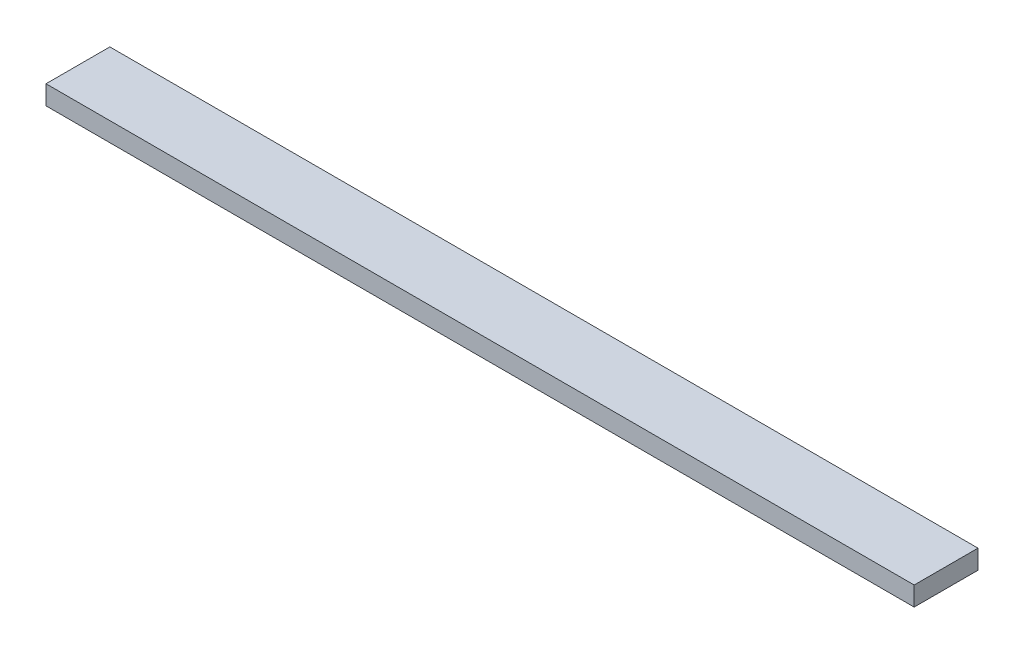
ISO-10303-21;
HEADER;
FILE_DESCRIPTION(('STEP AP214'),'2;1');
FILE_NAME('part.step','',(''),(''),'','','');
FILE_SCHEMA(('AUTOMOTIVE_DESIGN { 1 0 10303 214 1 1 1 1 }'));
ENDSEC;
DATA;
#1=APPLICATION_CONTEXT('core data for automotive mechanical design processes');
#2=APPLICATION_PROTOCOL_DEFINITION('international standard','automotive_design',2000,#1);
#3=PRODUCT_CONTEXT('',#1,'mechanical');
#4=PRODUCT('Part','Part','',(#3));
#5=PRODUCT_RELATED_PRODUCT_CATEGORY('part','',(#4));
#6=PRODUCT_DEFINITION_FORMATION('','',#4);
#7=PRODUCT_DEFINITION_CONTEXT('part definition',#1,'design');
#8=PRODUCT_DEFINITION('design','',#6,#7);
#9=PRODUCT_DEFINITION_SHAPE('','',#8);
#10=(LENGTH_UNIT() NAMED_UNIT(*) SI_UNIT(.MILLI.,.METRE.));
#11=(NAMED_UNIT(*) PLANE_ANGLE_UNIT() SI_UNIT($,.RADIAN.));
#12=(NAMED_UNIT(*) SI_UNIT($,.STERADIAN.) SOLID_ANGLE_UNIT());
#13=UNCERTAINTY_MEASURE_WITH_UNIT(LENGTH_MEASURE(1.E-05),#10,'distance_accuracy_value','');
#14=(GEOMETRIC_REPRESENTATION_CONTEXT(3) GLOBAL_UNCERTAINTY_ASSIGNED_CONTEXT((#13)) GLOBAL_UNIT_ASSIGNED_CONTEXT((#10,
#11,#12)) REPRESENTATION_CONTEXT('',''));
#15=CARTESIAN_POINT('',(0.,0.,0.));
#16=DIRECTION('',(0.,0.,1.));
#17=DIRECTION('',(1.,0.,0.));
#18=AXIS2_PLACEMENT_3D('',#15,#16,#17);
#19=CARTESIAN_POINT('',(-35.36,105.5,93.45));
#20=DIRECTION('',(0.,1.,0.));
#21=DIRECTION('',(1.,0.,0.));
#22=AXIS2_PLACEMENT_3D('',#19,#20,#21);
#23=PLANE('',#22);
#24=DIRECTION('',(1.,0.,0.));
#25=VECTOR('',#24,1.);
#26=CARTESIAN_POINT('',(0.,105.50000000004,88.35));
#27=LINE('',#26,#25);
#28=CARTESIAN_POINT('',(-34.,105.50000000002,88.35));
#29=VERTEX_POINT('',#28);
#30=CARTESIAN_POINT('',(34.,105.50000000002,88.35));
#31=VERTEX_POINT('',#30);
#32=EDGE_CURVE('E53',#29,#31,#27,.T.);
#33=ORIENTED_EDGE('',*,*,#32,.F.);
#34=DIRECTION('',(0.,0.,-1.));
#35=VECTOR('',#34,1.);
#36=CARTESIAN_POINT('',(-34.,105.50000000004,90.85));
#37=LINE('',#36,#35);
#38=CARTESIAN_POINT('',(-34.,105.50000000003,93.35));
#39=VERTEX_POINT('',#38);
#40=EDGE_CURVE('E68',#39,#29,#37,.T.);
#41=ORIENTED_EDGE('',*,*,#40,.F.);
#42=DIRECTION('',(-1.,0.,0.));
#43=VECTOR('',#42,1.);
#44=CARTESIAN_POINT('',(0.,105.50000000004,93.35));
#45=LINE('',#44,#43);
#46=CARTESIAN_POINT('',(34.,105.50000000002,93.35));
#47=VERTEX_POINT('',#46);
#48=EDGE_CURVE('E20',#47,#39,#45,.T.);
#49=ORIENTED_EDGE('',*,*,#48,.F.);
#50=DIRECTION('',(0.,0.,1.));
#51=VECTOR('',#50,1.);
#52=CARTESIAN_POINT('',(34.,105.50000000004,90.85));
#53=LINE('',#52,#51);
#54=EDGE_CURVE('E58',#31,#47,#53,.T.);
#55=ORIENTED_EDGE('',*,*,#54,.F.);
#56=EDGE_LOOP('',(#33,#41,#49,#55));
#57=FACE_BOUND('',#56,.T.);
#58=ADVANCED_FACE('F16',(#57),#23,.T.);
#59=CARTESIAN_POINT('',(-35.36,103.9181335233,93.35));
#60=DIRECTION('',(0.,0.,1.));
#61=DIRECTION('',(1.,0.,0.));
#62=AXIS2_PLACEMENT_3D('',#59,#60,#61);
#63=PLANE('',#62);
#64=ORIENTED_EDGE('',*,*,#48,.T.);
#65=DIRECTION('',(0.,1.,0.));
#66=VECTOR('',#65,1.);
#67=CARTESIAN_POINT('',(-34.,104.75,93.35));
#68=LINE('',#67,#66);
#69=CARTESIAN_POINT('',(-34.,103.99999999997,93.35));
#70=VERTEX_POINT('',#69);
#71=EDGE_CURVE('E79',#70,#39,#68,.T.);
#72=ORIENTED_EDGE('',*,*,#71,.F.);
#73=DIRECTION('',(1.,0.,0.));
#74=VECTOR('',#73,1.);
#75=CARTESIAN_POINT('',(0.,104.,93.35));
#76=LINE('',#75,#74);
#77=CARTESIAN_POINT('',(34.,103.99999999997,93.35));
#78=VERTEX_POINT('',#77);
#79=EDGE_CURVE('E74',#70,#78,#76,.T.);
#80=ORIENTED_EDGE('',*,*,#79,.T.);
#81=DIRECTION('',(0.,-1.,0.));
#82=VECTOR('',#81,1.);
#83=CARTESIAN_POINT('',(34.,104.75,93.35));
#84=LINE('',#83,#82);
#85=EDGE_CURVE('E63',#47,#78,#84,.T.);
#86=ORIENTED_EDGE('',*,*,#85,.F.);
#87=EDGE_LOOP('',(#64,#72,#80,#86));
#88=FACE_BOUND('',#87,.T.);
#89=ADVANCED_FACE('F73',(#88),#63,.T.);
#90=CARTESIAN_POINT('',(34.,103.9181335233,93.45));
#91=DIRECTION('',(1.,0.,0.));
#92=DIRECTION('',(0.,0.,-1.));
#93=AXIS2_PLACEMENT_3D('',#90,#91,#92);
#94=PLANE('',#93);
#95=ORIENTED_EDGE('',*,*,#54,.T.);
#96=ORIENTED_EDGE('',*,*,#85,.T.);
#97=DIRECTION('',(0.,0.,-1.));
#98=VECTOR('',#97,1.);
#99=CARTESIAN_POINT('',(34.,104.,90.85));
#100=LINE('',#99,#98);
#101=CARTESIAN_POINT('',(34.,103.99999999997,88.35));
#102=VERTEX_POINT('',#101);
#103=EDGE_CURVE('E84',#78,#102,#100,.T.);
#104=ORIENTED_EDGE('',*,*,#103,.T.);
#105=DIRECTION('',(0.,-1.,0.));
#106=VECTOR('',#105,1.);
#107=CARTESIAN_POINT('',(34.,104.75,88.35));
#108=LINE('',#107,#106);
#109=EDGE_CURVE('E65',#31,#102,#108,.T.);
#110=ORIENTED_EDGE('',*,*,#109,.F.);
#111=EDGE_LOOP('',(#95,#96,#104,#110));
#112=FACE_BOUND('',#111,.T.);
#113=ADVANCED_FACE('F60',(#112),#94,.T.);
#114=CARTESIAN_POINT('',(35.36,103.9181335233,88.35));
#115=DIRECTION('',(0.,0.,-1.));
#116=DIRECTION('',(-1.,0.,0.));
#117=AXIS2_PLACEMENT_3D('',#114,#115,#116);
#118=PLANE('',#117);
#119=ORIENTED_EDGE('',*,*,#32,.T.);
#120=ORIENTED_EDGE('',*,*,#109,.T.);
#121=DIRECTION('',(-1.,0.,0.));
#122=VECTOR('',#121,1.);
#123=CARTESIAN_POINT('',(0.,104.,88.35));
#124=LINE('',#123,#122);
#125=CARTESIAN_POINT('',(-34.,103.99999999997,88.35));
#126=VERTEX_POINT('',#125);
#127=EDGE_CURVE('E26',#102,#126,#124,.T.);
#128=ORIENTED_EDGE('',*,*,#127,.T.);
#129=DIRECTION('',(0.,-1.,0.));
#130=VECTOR('',#129,1.);
#131=CARTESIAN_POINT('',(-34.,104.75,88.35));
#132=LINE('',#131,#130);
#133=EDGE_CURVE('E34',#29,#126,#132,.T.);
#134=ORIENTED_EDGE('',*,*,#133,.F.);
#135=EDGE_LOOP('',(#119,#120,#128,#134));
#136=FACE_BOUND('',#135,.T.);
#137=ADVANCED_FACE('F88',(#136),#118,.T.);
#138=CARTESIAN_POINT('',(-34.,103.9181335233,88.25));
#139=DIRECTION('',(-1.,0.,0.));
#140=DIRECTION('',(0.,0.,1.));
#141=AXIS2_PLACEMENT_3D('',#138,#139,#140);
#142=PLANE('',#141);
#143=ORIENTED_EDGE('',*,*,#40,.T.);
#144=ORIENTED_EDGE('',*,*,#133,.T.);
#145=DIRECTION('',(0.,0.,1.));
#146=VECTOR('',#145,1.);
#147=CARTESIAN_POINT('',(-34.,104.,90.85));
#148=LINE('',#147,#146);
#149=EDGE_CURVE('E11',#126,#70,#148,.T.);
#150=ORIENTED_EDGE('',*,*,#149,.T.);
#151=ORIENTED_EDGE('',*,*,#71,.T.);
#152=EDGE_LOOP('',(#143,#144,#150,#151));
#153=FACE_BOUND('',#152,.T.);
#154=ADVANCED_FACE('F90',(#153),#142,.T.);
#155=CARTESIAN_POINT('',(-35.36,104.,93.45));
#156=DIRECTION('',(0.,1.,0.));
#157=DIRECTION('',(1.,0.,0.));
#158=AXIS2_PLACEMENT_3D('',#155,#156,#157);
#159=PLANE('',#158);
#160=ORIENTED_EDGE('',*,*,#127,.F.);
#161=ORIENTED_EDGE('',*,*,#103,.F.);
#162=ORIENTED_EDGE('',*,*,#79,.F.);
#163=ORIENTED_EDGE('',*,*,#149,.F.);
#164=EDGE_LOOP('',(#160,#161,#162,#163));
#165=FACE_BOUND('',#164,.T.);
#166=ADVANCED_FACE('F18',(#165),#159,.F.);
#167=CLOSED_SHELL('',(#58,#89,#113,#137,#154,#166));
#168=MANIFOLD_SOLID_BREP('B1',#167);
#169=ADVANCED_BREP_SHAPE_REPRESENTATION('',(#18,#168),#14);
#170=SHAPE_DEFINITION_REPRESENTATION(#9,#169);
ENDSEC;
END-ISO-10303-21;
